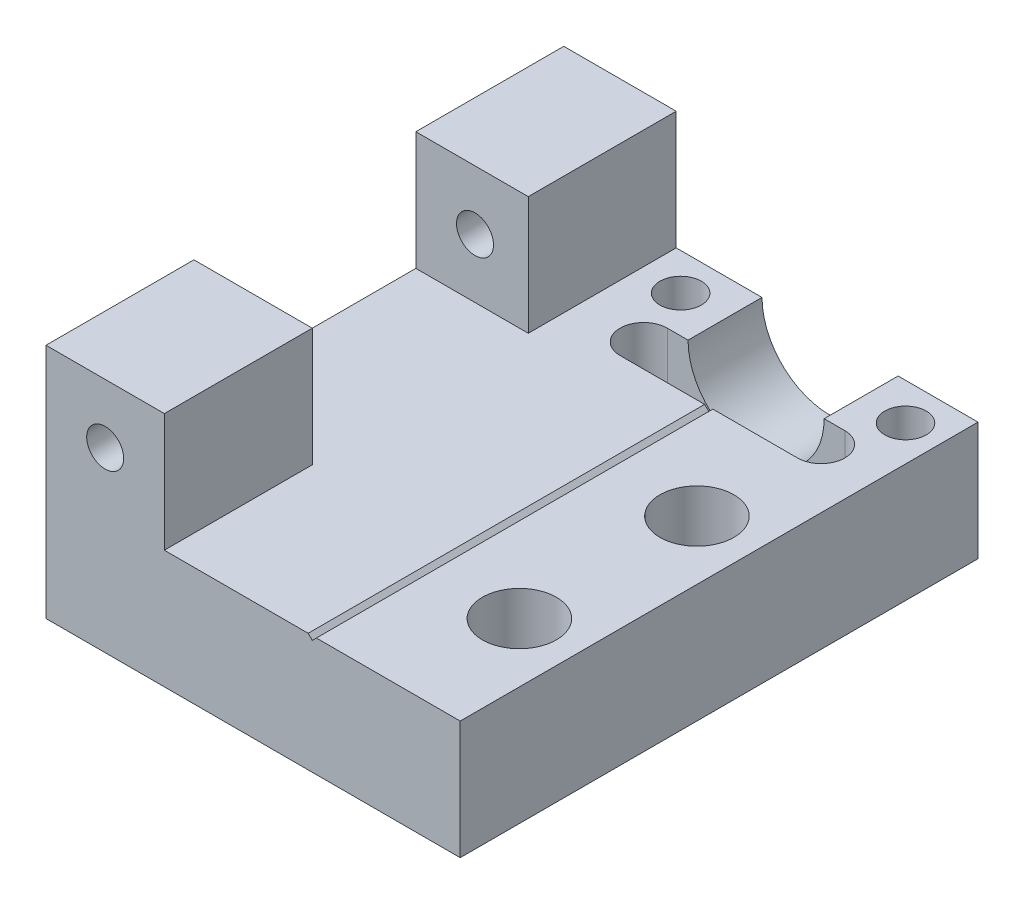
ISO-10303-21;
HEADER;
FILE_DESCRIPTION(('STEP AP214'),'2;1');
FILE_NAME('part.step','',(''),(''),'','','');
FILE_SCHEMA(('AUTOMOTIVE_DESIGN { 1 0 10303 214 1 1 1 1 }'));
ENDSEC;
DATA;
#1=APPLICATION_CONTEXT('core data for automotive mechanical design processes');
#2=APPLICATION_PROTOCOL_DEFINITION('international standard','automotive_design',2000,#1);
#3=PRODUCT_CONTEXT('',#1,'mechanical');
#4=PRODUCT('Part','Part','',(#3));
#5=PRODUCT_RELATED_PRODUCT_CATEGORY('part','',(#4));
#6=PRODUCT_DEFINITION_FORMATION('','',#4);
#7=PRODUCT_DEFINITION_CONTEXT('part definition',#1,'design');
#8=PRODUCT_DEFINITION('design','',#6,#7);
#9=PRODUCT_DEFINITION_SHAPE('','',#8);
#10=(LENGTH_UNIT() NAMED_UNIT(*) SI_UNIT(.MILLI.,.METRE.));
#11=(NAMED_UNIT(*) PLANE_ANGLE_UNIT() SI_UNIT($,.RADIAN.));
#12=(NAMED_UNIT(*) SI_UNIT($,.STERADIAN.) SOLID_ANGLE_UNIT());
#13=UNCERTAINTY_MEASURE_WITH_UNIT(LENGTH_MEASURE(1.E-05),#10,'distance_accuracy_value','');
#14=(GEOMETRIC_REPRESENTATION_CONTEXT(3) GLOBAL_UNCERTAINTY_ASSIGNED_CONTEXT((#13)) GLOBAL_UNIT_ASSIGNED_CONTEXT((#10,
#11,#12)) REPRESENTATION_CONTEXT('',''));
#15=CARTESIAN_POINT('',(0.,0.,0.));
#16=DIRECTION('',(0.,0.,1.));
#17=DIRECTION('',(1.,0.,0.));
#18=AXIS2_PLACEMENT_3D('',#15,#16,#17);
#19=CARTESIAN_POINT('',(0.,5.08,3.175));
#20=DIRECTION('',(0.,-1.,0.));
#21=DIRECTION('',(0.,0.,-1.));
#22=AXIS2_PLACEMENT_3D('',#19,#20,#21);
#23=PLANE('',#22);
#24=CARTESIAN_POINT('',(1.524,5.08,1.5875));
#25=DIRECTION('',(0.,1.,0.));
#26=DIRECTION('',(0.,0.,1.));
#27=AXIS2_PLACEMENT_3D('',#24,#25,#26);
#28=CIRCLE('',#27,0.888999999999998);
#29=CARTESIAN_POINT('',(1.524,5.08,2.4765));
#30=VERTEX_POINT('',#29);
#31=EDGE_CURVE('E288',#30,#30,#28,.T.);
#32=ORIENTED_EDGE('',*,*,#31,.F.);
#33=EDGE_LOOP('',(#32));
#34=FACE_BOUND('',#33,.T.);
#35=DIRECTION('',(0.,0.,-1.));
#36=VECTOR('',#35,1.);
#37=CARTESIAN_POINT('',(0.,5.08,22.225));
#38=LINE('',#37,#36);
#39=CARTESIAN_POINT('',(0.,5.08,22.225));
#40=VERTEX_POINT('',#39);
#41=CARTESIAN_POINT('',(0.,5.08,15.875));
#42=VERTEX_POINT('',#41);
#43=EDGE_CURVE('E205',#40,#42,#38,.T.);
#44=ORIENTED_EDGE('',*,*,#43,.F.);
#45=DIRECTION('',(-1.,0.,0.));
#46=VECTOR('',#45,1.);
#47=CARTESIAN_POINT('',(12.7,5.08,22.225));
#48=LINE('',#47,#46);
#49=CARTESIAN_POINT('',(6.17322330470336,5.08,22.225));
#50=VERTEX_POINT('',#49);
#51=EDGE_CURVE('E364',#50,#40,#48,.T.);
#52=ORIENTED_EDGE('',*,*,#51,.F.);
#53=DIRECTION('',(0.,0.,1.));
#54=VECTOR('',#53,1.);
#55=CARTESIAN_POINT('',(6.17322330470336,5.08,0.));
#56=LINE('',#55,#54);
#57=CARTESIAN_POINT('',(6.17322330470336,5.08,5.207));
#58=VERTEX_POINT('',#57);
#59=EDGE_CURVE('E304',#58,#50,#56,.T.);
#60=ORIENTED_EDGE('',*,*,#59,.F.);
#61=DIRECTION('',(1.,0.,0.));
#62=VECTOR('',#61,1.);
#63=CARTESIAN_POINT('',(2.54,5.08,5.207));
#64=LINE('',#63,#62);
#65=CARTESIAN_POINT('',(2.54,5.08,5.207));
#66=VERTEX_POINT('',#65);
#67=EDGE_CURVE('E338',#66,#58,#64,.T.);
#68=ORIENTED_EDGE('',*,*,#67,.F.);
#69=CARTESIAN_POINT('',(2.54,5.08,4.191));
#70=DIRECTION('',(0.,1.,0.));
#71=DIRECTION('',(0.,0.,1.));
#72=AXIS2_PLACEMENT_3D('',#69,#70,#71);
#73=CIRCLE('',#72,1.016);
#74=CARTESIAN_POINT('',(2.54,5.08,3.175));
#75=VERTEX_POINT('',#74);
#76=EDGE_CURVE('E316',#75,#66,#73,.T.);
#77=ORIENTED_EDGE('',*,*,#76,.F.);
#78=DIRECTION('',(1.,0.,0.));
#79=VECTOR('',#78,1.);
#80=CARTESIAN_POINT('',(2.54,5.08,3.175));
#81=LINE('',#80,#79);
#82=CARTESIAN_POINT('',(3.429,5.08,3.175));
#83=VERTEX_POINT('',#82);
#84=EDGE_CURVE('E329',#75,#83,#81,.T.);
#85=ORIENTED_EDGE('',*,*,#84,.T.);
#86=DIRECTION('',(0.,0.,-1.));
#87=VECTOR('',#86,1.);
#88=CARTESIAN_POINT('',(3.429,5.08,3.175));
#89=LINE('',#88,#87);
#90=CARTESIAN_POINT('',(3.429,5.08,0.));
#91=VERTEX_POINT('',#90);
#92=EDGE_CURVE('E374',#83,#91,#89,.T.);
#93=ORIENTED_EDGE('',*,*,#92,.T.);
#94=DIRECTION('',(-1.,0.,0.));
#95=VECTOR('',#94,1.);
#96=CARTESIAN_POINT('',(0.,5.08,0.));
#97=LINE('',#96,#95);
#98=CARTESIAN_POINT('',(-0.253999999999997,5.08,0.));
#99=VERTEX_POINT('',#98);
#100=EDGE_CURVE('E375',#91,#99,#97,.T.);
#101=ORIENTED_EDGE('',*,*,#100,.T.);
#102=DIRECTION('',(0.,0.,-1.));
#103=VECTOR('',#102,1.);
#104=CARTESIAN_POINT('',(-0.253999999999997,5.08,0.));
#105=LINE('',#104,#103);
#106=CARTESIAN_POINT('',(-0.253999999999996,5.08,6.35));
#107=VERTEX_POINT('',#106);
#108=EDGE_CURVE('E231',#107,#99,#105,.T.);
#109=ORIENTED_EDGE('',*,*,#108,.F.);
#110=DIRECTION('',(1.,0.,0.));
#111=VECTOR('',#110,1.);
#112=CARTESIAN_POINT('',(-5.08,5.08,6.35));
#113=LINE('',#112,#111);
#114=CARTESIAN_POINT('',(-5.08,5.08,6.35));
#115=VERTEX_POINT('',#114);
#116=EDGE_CURVE('E225',#115,#107,#113,.T.);
#117=ORIENTED_EDGE('',*,*,#116,.F.);
#118=DIRECTION('',(0.,0.,-1.));
#119=VECTOR('',#118,1.);
#120=CARTESIAN_POINT('',(-5.08,5.08,22.225));
#121=LINE('',#120,#119);
#122=CARTESIAN_POINT('',(-5.08,5.08,15.875));
#123=VERTEX_POINT('',#122);
#124=EDGE_CURVE('E262',#123,#115,#121,.T.);
#125=ORIENTED_EDGE('',*,*,#124,.F.);
#126=DIRECTION('',(-1.,0.,0.));
#127=VECTOR('',#126,1.);
#128=CARTESIAN_POINT('',(-5.08,5.08,15.875));
#129=LINE('',#128,#127);
#130=EDGE_CURVE('E202',#42,#123,#129,.T.);
#131=ORIENTED_EDGE('',*,*,#130,.F.);
#132=EDGE_LOOP('',(#44,#52,#60,#68,#77,#85,#93,#101,#109,#117,#125,#131));
#133=FACE_BOUND('',#132,.T.);
#134=ADVANCED_FACE('F41',(#34,#133),#23,.F.);
#135=CARTESIAN_POINT('',(10.16,5.08,17.145));
#136=DIRECTION('',(0.,1.,0.));
#137=DIRECTION('',(0.,0.,1.));
#138=AXIS2_PLACEMENT_3D('',#135,#136,#137);
#139=CIRCLE('',#138,1.5875);
#140=CARTESIAN_POINT('',(10.16,5.08,18.7325));
#141=VERTEX_POINT('',#140);
#142=EDGE_CURVE('E263',#141,#141,#139,.T.);
#143=ORIENTED_EDGE('',*,*,#142,.F.);
#144=EDGE_LOOP('',(#143));
#145=FACE_BOUND('',#144,.T.);
#146=CARTESIAN_POINT('',(10.16,5.08,9.525));
#147=DIRECTION('',(0.,1.,0.));
#148=DIRECTION('',(0.,0.,1.));
#149=AXIS2_PLACEMENT_3D('',#146,#147,#148);
#150=CIRCLE('',#149,1.5875);
#151=CARTESIAN_POINT('',(10.16,5.08,11.1125));
#152=VERTEX_POINT('',#151);
#153=EDGE_CURVE('E257',#152,#152,#150,.T.);
#154=ORIENTED_EDGE('',*,*,#153,.F.);
#155=EDGE_LOOP('',(#154));
#156=FACE_BOUND('',#155,.T.);
#157=CARTESIAN_POINT('',(6.52677669529664,5.08,5.207));
#158=VERTEX_POINT('',#157);
#159=CARTESIAN_POINT('',(10.16,5.08,5.207));
#160=VERTEX_POINT('',#159);
#161=EDGE_CURVE('E337',#158,#160,#64,.T.);
#162=ORIENTED_EDGE('',*,*,#161,.F.);
#163=DIRECTION('',(0.,0.,1.));
#164=VECTOR('',#163,1.);
#165=CARTESIAN_POINT('',(6.52677669529663,5.08,0.));
#166=LINE('',#165,#164);
#167=CARTESIAN_POINT('',(6.52677669529663,5.08,22.225));
#168=VERTEX_POINT('',#167);
#169=EDGE_CURVE('E66',#158,#168,#166,.T.);
#170=ORIENTED_EDGE('',*,*,#169,.T.);
#171=CARTESIAN_POINT('',(12.7,5.08,22.225));
#172=VERTEX_POINT('',#171);
#173=EDGE_CURVE('E359',#172,#168,#48,.T.);
#174=ORIENTED_EDGE('',*,*,#173,.F.);
#175=DIRECTION('',(0.,0.,-1.));
#176=VECTOR('',#175,1.);
#177=CARTESIAN_POINT('',(12.7,5.08,3.175));
#178=LINE('',#177,#176);
#179=CARTESIAN_POINT('',(12.7,5.08,0.));
#180=VERTEX_POINT('',#179);
#181=EDGE_CURVE('E397',#172,#180,#178,.T.);
#182=ORIENTED_EDGE('',*,*,#181,.T.);
#183=DIRECTION('',(-1.,0.,0.));
#184=VECTOR('',#183,1.);
#185=CARTESIAN_POINT('',(9.271,5.08,0.));
#186=LINE('',#185,#184);
#187=CARTESIAN_POINT('',(9.271,5.08,0.));
#188=VERTEX_POINT('',#187);
#189=EDGE_CURVE('E381',#180,#188,#186,.T.);
#190=ORIENTED_EDGE('',*,*,#189,.T.);
#191=DIRECTION('',(0.,0.,-1.));
#192=VECTOR('',#191,1.);
#193=CARTESIAN_POINT('',(9.271,5.08,3.175));
#194=LINE('',#193,#192);
#195=CARTESIAN_POINT('',(9.271,5.08,3.175));
#196=VERTEX_POINT('',#195);
#197=EDGE_CURVE('E393',#196,#188,#194,.T.);
#198=ORIENTED_EDGE('',*,*,#197,.F.);
#199=CARTESIAN_POINT('',(10.16,5.08,3.175));
#200=VERTEX_POINT('',#199);
#201=EDGE_CURVE('E307',#196,#200,#81,.T.);
#202=ORIENTED_EDGE('',*,*,#201,.T.);
#203=CARTESIAN_POINT('',(10.16,5.08,4.191));
#204=DIRECTION('',(0.,1.,0.));
#205=DIRECTION('',(0.,0.,1.));
#206=AXIS2_PLACEMENT_3D('',#203,#204,#205);
#207=CIRCLE('',#206,1.016);
#208=EDGE_CURVE('E333',#160,#200,#207,.T.);
#209=ORIENTED_EDGE('',*,*,#208,.F.);
#210=EDGE_LOOP('',(#162,#170,#174,#182,#190,#198,#202,#209));
#211=FACE_BOUND('',#210,.T.);
#212=CARTESIAN_POINT('',(11.176,5.08,1.5875));
#213=DIRECTION('',(0.,1.,0.));
#214=DIRECTION('',(0.,0.,1.));
#215=AXIS2_PLACEMENT_3D('',#212,#213,#214);
#216=CIRCLE('',#215,0.888999999999997);
#217=CARTESIAN_POINT('',(11.176,5.08,2.4765));
#218=VERTEX_POINT('',#217);
#219=EDGE_CURVE('E185',#218,#218,#216,.T.);
#220=ORIENTED_EDGE('',*,*,#219,.F.);
#221=EDGE_LOOP('',(#220));
#222=FACE_BOUND('',#221,.T.);
#223=ADVANCED_FACE('F412',(#145,#156,#211,#222),#23,.F.);
#224=CARTESIAN_POINT('',(0.,0.,3.175));
#225=DIRECTION('',(0.,1.,0.));
#226=DIRECTION('',(0.,0.,1.));
#227=AXIS2_PLACEMENT_3D('',#224,#225,#226);
#228=PLANE('',#227);
#229=CARTESIAN_POINT('',(10.16,0.,17.145));
#230=DIRECTION('',(0.,1.,0.));
#231=DIRECTION('',(0.,0.,1.));
#232=AXIS2_PLACEMENT_3D('',#229,#230,#231);
#233=CIRCLE('',#232,0.595376);
#234=CARTESIAN_POINT('',(10.16,0.,17.740376));
#235=VERTEX_POINT('',#234);
#236=EDGE_CURVE('E567',#235,#235,#233,.T.);
#237=ORIENTED_EDGE('',*,*,#236,.T.);
#238=EDGE_LOOP('',(#237));
#239=FACE_BOUND('',#238,.T.);
#240=CARTESIAN_POINT('',(10.16,0.,9.525));
#241=DIRECTION('',(0.,1.,0.));
#242=DIRECTION('',(0.,0.,1.));
#243=AXIS2_PLACEMENT_3D('',#240,#241,#242);
#244=CIRCLE('',#243,0.595376);
#245=CARTESIAN_POINT('',(10.16,0.,10.120376));
#246=VERTEX_POINT('',#245);
#247=EDGE_CURVE('E551',#246,#246,#244,.T.);
#248=ORIENTED_EDGE('',*,*,#247,.T.);
#249=EDGE_LOOP('',(#248));
#250=FACE_BOUND('',#249,.T.);
#251=CARTESIAN_POINT('',(11.176,0.,1.5875));
#252=DIRECTION('',(0.,1.,0.));
#253=DIRECTION('',(0.,0.,1.));
#254=AXIS2_PLACEMENT_3D('',#251,#252,#253);
#255=CIRCLE('',#254,0.888999999999998);
#256=CARTESIAN_POINT('',(11.176,0.,2.4765));
#257=VERTEX_POINT('',#256);
#258=EDGE_CURVE('E284',#257,#257,#255,.T.);
#259=ORIENTED_EDGE('',*,*,#258,.T.);
#260=EDGE_LOOP('',(#259));
#261=FACE_BOUND('',#260,.T.);
#262=CARTESIAN_POINT('',(1.524,0.,1.5875));
#263=DIRECTION('',(0.,1.,0.));
#264=DIRECTION('',(0.,0.,1.));
#265=AXIS2_PLACEMENT_3D('',#262,#263,#264);
#266=CIRCLE('',#265,0.888999999999998);
#267=CARTESIAN_POINT('',(1.524,0.,2.4765));
#268=VERTEX_POINT('',#267);
#269=EDGE_CURVE('E292',#268,#268,#266,.T.);
#270=ORIENTED_EDGE('',*,*,#269,.T.);
#271=EDGE_LOOP('',(#270));
#272=FACE_BOUND('',#271,.T.);
#273=DIRECTION('',(1.,0.,0.));
#274=VECTOR('',#273,1.);
#275=CARTESIAN_POINT('',(0.,0.,0.));
#276=LINE('',#275,#274);
#277=CARTESIAN_POINT('',(-5.08,0.,0.));
#278=VERTEX_POINT('',#277);
#279=CARTESIAN_POINT('',(12.7,0.,0.));
#280=VERTEX_POINT('',#279);
#281=EDGE_CURVE('E370',#278,#280,#276,.T.);
#282=ORIENTED_EDGE('',*,*,#281,.T.);
#283=DIRECTION('',(0.,0.,-1.));
#284=VECTOR('',#283,1.);
#285=CARTESIAN_POINT('',(12.7,0.,3.175));
#286=LINE('',#285,#284);
#287=CARTESIAN_POINT('',(12.7,0.,22.225));
#288=VERTEX_POINT('',#287);
#289=EDGE_CURVE('E401',#288,#280,#286,.T.);
#290=ORIENTED_EDGE('',*,*,#289,.F.);
#291=DIRECTION('',(-1.,0.,0.));
#292=VECTOR('',#291,1.);
#293=CARTESIAN_POINT('',(12.7,0.,22.225));
#294=LINE('',#293,#292);
#295=CARTESIAN_POINT('',(-5.08,0.,22.225));
#296=VERTEX_POINT('',#295);
#297=EDGE_CURVE('E358',#288,#296,#294,.T.);
#298=ORIENTED_EDGE('',*,*,#297,.T.);
#299=DIRECTION('',(0.,0.,1.));
#300=VECTOR('',#299,1.);
#301=CARTESIAN_POINT('',(-5.08,0.,22.225));
#302=LINE('',#301,#300);
#303=EDGE_CURVE('E181',#278,#296,#302,.T.);
#304=ORIENTED_EDGE('',*,*,#303,.F.);
#305=EDGE_LOOP('',(#282,#290,#298,#304));
#306=FACE_BOUND('',#305,.T.);
#307=DIRECTION('',(1.,0.,0.));
#308=VECTOR('',#307,1.);
#309=CARTESIAN_POINT('',(2.54,0.,3.175));
#310=LINE('',#309,#308);
#311=CARTESIAN_POINT('',(2.54,0.,3.175));
#312=VERTEX_POINT('',#311);
#313=CARTESIAN_POINT('',(10.16,0.,3.175));
#314=VERTEX_POINT('',#313);
#315=EDGE_CURVE('E312',#312,#314,#310,.T.);
#316=ORIENTED_EDGE('',*,*,#315,.F.);
#317=CARTESIAN_POINT('',(2.54,0.,4.191));
#318=DIRECTION('',(0.,1.,0.));
#319=DIRECTION('',(0.,0.,1.));
#320=AXIS2_PLACEMENT_3D('',#317,#318,#319);
#321=CIRCLE('',#320,1.016);
#322=CARTESIAN_POINT('',(2.54,0.,5.207));
#323=VERTEX_POINT('',#322);
#324=EDGE_CURVE('E324',#312,#323,#321,.T.);
#325=ORIENTED_EDGE('',*,*,#324,.T.);
#326=DIRECTION('',(1.,0.,0.));
#327=VECTOR('',#326,1.);
#328=CARTESIAN_POINT('',(2.54,0.,5.207));
#329=LINE('',#328,#327);
#330=CARTESIAN_POINT('',(10.16,0.,5.207));
#331=VERTEX_POINT('',#330);
#332=EDGE_CURVE('E320',#323,#331,#329,.T.);
#333=ORIENTED_EDGE('',*,*,#332,.T.);
#334=CARTESIAN_POINT('',(10.16,0.,4.191));
#335=DIRECTION('',(0.,1.,0.));
#336=DIRECTION('',(0.,0.,1.));
#337=AXIS2_PLACEMENT_3D('',#334,#335,#336);
#338=CIRCLE('',#337,1.016);
#339=EDGE_CURVE('E315',#331,#314,#338,.T.);
#340=ORIENTED_EDGE('',*,*,#339,.T.);
#341=EDGE_LOOP('',(#316,#325,#333,#340));
#342=FACE_BOUND('',#341,.T.);
#343=ADVANCED_FACE('F43',(#239,#250,#261,#272,#306,#342),#228,.F.);
#344=CARTESIAN_POINT('',(12.7,0.,3.175));
#345=DIRECTION('',(-1.,0.,0.));
#346=DIRECTION('',(0.,0.,1.));
#347=AXIS2_PLACEMENT_3D('',#344,#345,#346);
#348=PLANE('',#347);
#349=DIRECTION('',(0.,1.,0.));
#350=VECTOR('',#349,1.);
#351=CARTESIAN_POINT('',(12.7,0.,0.));
#352=LINE('',#351,#350);
#353=EDGE_CURVE('E378',#280,#180,#352,.T.);
#354=ORIENTED_EDGE('',*,*,#353,.T.);
#355=ORIENTED_EDGE('',*,*,#181,.F.);
#356=DIRECTION('',(0.,-1.,0.));
#357=VECTOR('',#356,1.);
#358=CARTESIAN_POINT('',(12.7,5.08,22.225));
#359=LINE('',#358,#357);
#360=EDGE_CURVE('E363',#172,#288,#359,.T.);
#361=ORIENTED_EDGE('',*,*,#360,.T.);
#362=ORIENTED_EDGE('',*,*,#289,.T.);
#363=EDGE_LOOP('',(#354,#355,#361,#362));
#364=FACE_BOUND('',#363,.T.);
#365=ADVANCED_FACE('F435',(#364),#348,.F.);
#366=CARTESIAN_POINT('',(6.35,5.08,3.175));
#367=DIRECTION('',(0.,0.,-1.));
#368=DIRECTION('',(-1.,0.,0.));
#369=AXIS2_PLACEMENT_3D('',#366,#367,#368);
#370=CYLINDRICAL_SURFACE('',#369,2.921);
#371=CARTESIAN_POINT('',(6.35,5.08,0.));
#372=DIRECTION('',(0.,0.,-1.));
#373=DIRECTION('',(1.,0.,0.));
#374=AXIS2_PLACEMENT_3D('',#371,#372,#373);
#375=CIRCLE('',#374,2.921);
#376=EDGE_CURVE('E384',#188,#91,#375,.T.);
#377=ORIENTED_EDGE('',*,*,#376,.T.);
#378=ORIENTED_EDGE('',*,*,#92,.F.);
#379=CARTESIAN_POINT('',(6.35,5.08,3.175));
#380=DIRECTION('',(0.,0.,-1.));
#381=DIRECTION('',(1.,0.,0.));
#382=AXIS2_PLACEMENT_3D('',#379,#380,#381);
#383=CIRCLE('',#382,2.921);
#384=EDGE_CURVE('E371',#196,#83,#383,.T.);
#385=ORIENTED_EDGE('',*,*,#384,.F.);
#386=ORIENTED_EDGE('',*,*,#197,.T.);
#387=EDGE_LOOP('',(#377,#378,#385,#386));
#388=FACE_BOUND('',#387,.T.);
#389=ADVANCED_FACE('F441',(#388),#370,.F.);
#390=CARTESIAN_POINT('',(6.35,5.08,0.));
#391=DIRECTION('',(0.,0.,1.));
#392=DIRECTION('',(1.,0.,0.));
#393=AXIS2_PLACEMENT_3D('',#390,#391,#392);
#394=PLANE('',#393);
#395=CARTESIAN_POINT('',(-2.54,7.62,0.));
#396=DIRECTION('',(0.,0.,1.));
#397=DIRECTION('',(1.,0.,0.));
#398=AXIS2_PLACEMENT_3D('',#395,#396,#397);
#399=CIRCLE('',#398,0.793749999999995);
#400=CARTESIAN_POINT('',(-1.74625000000001,7.62,0.));
#401=VERTEX_POINT('',#400);
#402=EDGE_CURVE('E550',#401,#401,#399,.T.);
#403=ORIENTED_EDGE('',*,*,#402,.T.);
#404=EDGE_LOOP('',(#403));
#405=FACE_BOUND('',#404,.T.);
#406=ORIENTED_EDGE('',*,*,#281,.F.);
#407=DIRECTION('',(0.,-1.,0.));
#408=VECTOR('',#407,1.);
#409=CARTESIAN_POINT('',(-5.08,5.08,0.));
#410=LINE('',#409,#408);
#411=CARTESIAN_POINT('',(-5.08,10.16,0.));
#412=VERTEX_POINT('',#411);
#413=EDGE_CURVE('E276',#412,#278,#410,.T.);
#414=ORIENTED_EDGE('',*,*,#413,.F.);
#415=DIRECTION('',(-1.,0.,0.));
#416=VECTOR('',#415,1.);
#417=CARTESIAN_POINT('',(-5.08,10.16,0.));
#418=LINE('',#417,#416);
#419=CARTESIAN_POINT('',(-0.253999999999997,10.16,0.));
#420=VERTEX_POINT('',#419);
#421=EDGE_CURVE('E237',#420,#412,#418,.T.);
#422=ORIENTED_EDGE('',*,*,#421,.F.);
#423=DIRECTION('',(0.,-1.,0.));
#424=VECTOR('',#423,1.);
#425=CARTESIAN_POINT('',(-0.253999999999997,10.16,0.));
#426=LINE('',#425,#424);
#427=EDGE_CURVE('E241',#420,#99,#426,.T.);
#428=ORIENTED_EDGE('',*,*,#427,.T.);
#429=ORIENTED_EDGE('',*,*,#100,.F.);
#430=ORIENTED_EDGE('',*,*,#376,.F.);
#431=ORIENTED_EDGE('',*,*,#189,.F.);
#432=ORIENTED_EDGE('',*,*,#353,.F.);
#433=EDGE_LOOP('',(#406,#414,#422,#428,#429,#430,#431,#432));
#434=FACE_BOUND('',#433,.T.);
#435=ADVANCED_FACE('F455',(#405,#434),#394,.F.);
#436=CARTESIAN_POINT('',(12.7,5.08,22.225));
#437=DIRECTION('',(0.,0.,1.));
#438=DIRECTION('',(1.,0.,0.));
#439=AXIS2_PLACEMENT_3D('',#436,#437,#438);
#440=PLANE('',#439);
#441=CARTESIAN_POINT('',(-2.54,7.62,22.225));
#442=DIRECTION('',(0.,0.,1.));
#443=DIRECTION('',(1.,0.,0.));
#444=AXIS2_PLACEMENT_3D('',#441,#442,#443);
#445=CIRCLE('',#444,0.793749999999997);
#446=CARTESIAN_POINT('',(-1.74625,7.62,22.225));
#447=VERTEX_POINT('',#446);
#448=EDGE_CURVE('E547',#447,#447,#445,.T.);
#449=ORIENTED_EDGE('',*,*,#448,.F.);
#450=EDGE_LOOP('',(#449));
#451=FACE_BOUND('',#450,.T.);
#452=DIRECTION('',(0.707106781186556,-0.707106781186539,0.));
#453=VECTOR('',#452,1.);
#454=CARTESIAN_POINT('',(6.17322330470336,5.08,22.225));
#455=LINE('',#454,#453);
#456=CARTESIAN_POINT('',(6.35,4.90322330470336,22.225));
#457=VERTEX_POINT('',#456);
#458=EDGE_CURVE('E296',#50,#457,#455,.T.);
#459=ORIENTED_EDGE('',*,*,#458,.F.);
#460=ORIENTED_EDGE('',*,*,#51,.T.);
#461=DIRECTION('',(0.,-1.,0.));
#462=VECTOR('',#461,1.);
#463=CARTESIAN_POINT('',(0.,10.16,22.225));
#464=LINE('',#463,#462);
#465=CARTESIAN_POINT('',(0.,10.16,22.225));
#466=VERTEX_POINT('',#465);
#467=EDGE_CURVE('E192',#466,#40,#464,.T.);
#468=ORIENTED_EDGE('',*,*,#467,.F.);
#469=DIRECTION('',(1.,0.,0.));
#470=VECTOR('',#469,1.);
#471=CARTESIAN_POINT('',(-5.08,10.16,22.225));
#472=LINE('',#471,#470);
#473=CARTESIAN_POINT('',(-5.08,10.16,22.225));
#474=VERTEX_POINT('',#473);
#475=EDGE_CURVE('E188',#474,#466,#472,.T.);
#476=ORIENTED_EDGE('',*,*,#475,.F.);
#477=DIRECTION('',(0.,1.,0.));
#478=VECTOR('',#477,1.);
#479=CARTESIAN_POINT('',(-5.08,5.08,22.225));
#480=LINE('',#479,#478);
#481=EDGE_CURVE('E174',#296,#474,#480,.T.);
#482=ORIENTED_EDGE('',*,*,#481,.F.);
#483=ORIENTED_EDGE('',*,*,#297,.F.);
#484=ORIENTED_EDGE('',*,*,#360,.F.);
#485=ORIENTED_EDGE('',*,*,#173,.T.);
#486=DIRECTION('',(0.707106781186539,0.707106781186556,0.));
#487=VECTOR('',#486,1.);
#488=CARTESIAN_POINT('',(6.35,4.90322330470336,22.225));
#489=LINE('',#488,#487);
#490=EDGE_CURVE('E300',#457,#168,#489,.T.);
#491=ORIENTED_EDGE('',*,*,#490,.F.);
#492=EDGE_LOOP('',(#459,#460,#468,#476,#482,#483,#484,#485,#491));
#493=FACE_BOUND('',#492,.T.);
#494=ADVANCED_FACE('F190',(#451,#493),#440,.T.);
#495=CARTESIAN_POINT('',(2.54,0.,3.175));
#496=DIRECTION('',(0.,0.,1.));
#497=DIRECTION('',(1.,0.,0.));
#498=AXIS2_PLACEMENT_3D('',#495,#496,#497);
#499=PLANE('',#498);
#500=ORIENTED_EDGE('',*,*,#384,.T.);
#501=ORIENTED_EDGE('',*,*,#84,.F.);
#502=DIRECTION('',(0.,1.,0.));
#503=VECTOR('',#502,1.);
#504=CARTESIAN_POINT('',(2.54,0.,3.175));
#505=LINE('',#504,#503);
#506=EDGE_CURVE('E328',#312,#75,#505,.T.);
#507=ORIENTED_EDGE('',*,*,#506,.F.);
#508=ORIENTED_EDGE('',*,*,#315,.T.);
#509=DIRECTION('',(0.,1.,0.));
#510=VECTOR('',#509,1.);
#511=CARTESIAN_POINT('',(10.16,0.,3.175));
#512=LINE('',#511,#510);
#513=EDGE_CURVE('E355',#314,#200,#512,.T.);
#514=ORIENTED_EDGE('',*,*,#513,.T.);
#515=ORIENTED_EDGE('',*,*,#201,.F.);
#516=EDGE_LOOP('',(#500,#501,#507,#508,#514,#515));
#517=FACE_BOUND('',#516,.T.);
#518=ADVANCED_FACE('F421',(#517),#499,.T.);
#519=CARTESIAN_POINT('',(10.16,0.,4.191));
#520=DIRECTION('',(0.,1.,0.));
#521=DIRECTION('',(0.,0.,1.));
#522=AXIS2_PLACEMENT_3D('',#519,#520,#521);
#523=CYLINDRICAL_SURFACE('',#522,1.016);
#524=ORIENTED_EDGE('',*,*,#208,.T.);
#525=ORIENTED_EDGE('',*,*,#513,.F.);
#526=ORIENTED_EDGE('',*,*,#339,.F.);
#527=DIRECTION('',(0.,1.,0.));
#528=VECTOR('',#527,1.);
#529=CARTESIAN_POINT('',(10.16,0.,5.207));
#530=LINE('',#529,#528);
#531=EDGE_CURVE('E351',#331,#160,#530,.T.);
#532=ORIENTED_EDGE('',*,*,#531,.T.);
#533=EDGE_LOOP('',(#524,#525,#526,#532));
#534=FACE_BOUND('',#533,.T.);
#535=ADVANCED_FACE('F426',(#534),#523,.F.);
#536=CARTESIAN_POINT('',(2.54,0.,5.207));
#537=DIRECTION('',(0.,0.,1.));
#538=DIRECTION('',(1.,0.,0.));
#539=AXIS2_PLACEMENT_3D('',#536,#537,#538);
#540=PLANE('',#539);
#541=ORIENTED_EDGE('',*,*,#67,.T.);
#542=DIRECTION('',(0.707106781186556,-0.707106781186539,0.));
#543=VECTOR('',#542,1.);
#544=CARTESIAN_POINT('',(6.89661165235163,4.35661165235174,5.207));
#545=LINE('',#544,#543);
#546=CARTESIAN_POINT('',(6.35,4.90322330470336,5.207));
#547=VERTEX_POINT('',#546);
#548=EDGE_CURVE('E11',#58,#547,#545,.T.);
#549=ORIENTED_EDGE('',*,*,#548,.T.);
#550=DIRECTION('',(0.707106781186539,0.707106781186556,0.));
#551=VECTOR('',#550,1.);
#552=CARTESIAN_POINT('',(1.99338834764837,0.546611652351621,5.207));
#553=LINE('',#552,#551);
#554=EDGE_CURVE('E51',#547,#158,#553,.T.);
#555=ORIENTED_EDGE('',*,*,#554,.T.);
#556=ORIENTED_EDGE('',*,*,#161,.T.);
#557=ORIENTED_EDGE('',*,*,#531,.F.);
#558=ORIENTED_EDGE('',*,*,#332,.F.);
#559=DIRECTION('',(0.,1.,0.));
#560=VECTOR('',#559,1.);
#561=CARTESIAN_POINT('',(2.54,0.,5.207));
#562=LINE('',#561,#560);
#563=EDGE_CURVE('E348',#323,#66,#562,.T.);
#564=ORIENTED_EDGE('',*,*,#563,.T.);
#565=EDGE_LOOP('',(#541,#549,#555,#556,#557,#558,#564));
#566=FACE_BOUND('',#565,.T.);
#567=ADVANCED_FACE('F408',(#566),#540,.F.);
#568=CARTESIAN_POINT('',(2.54,0.,4.191));
#569=DIRECTION('',(0.,1.,0.));
#570=DIRECTION('',(0.,0.,1.));
#571=AXIS2_PLACEMENT_3D('',#568,#569,#570);
#572=CYLINDRICAL_SURFACE('',#571,1.016);
#573=ORIENTED_EDGE('',*,*,#76,.T.);
#574=ORIENTED_EDGE('',*,*,#563,.F.);
#575=ORIENTED_EDGE('',*,*,#324,.F.);
#576=ORIENTED_EDGE('',*,*,#506,.T.);
#577=EDGE_LOOP('',(#573,#574,#575,#576));
#578=FACE_BOUND('',#577,.T.);
#579=ADVANCED_FACE('F431',(#578),#572,.F.);
#580=CARTESIAN_POINT('',(6.17322330470336,5.08,0.));
#581=DIRECTION('',(-0.707106781186539,-0.707106781186556,0.));
#582=DIRECTION('',(0.707106781186556,-0.707106781186539,0.));
#583=AXIS2_PLACEMENT_3D('',#580,#581,#582);
#584=PLANE('',#583);
#585=ORIENTED_EDGE('',*,*,#59,.T.);
#586=ORIENTED_EDGE('',*,*,#458,.T.);
#587=DIRECTION('',(0.,0.,1.));
#588=VECTOR('',#587,1.);
#589=CARTESIAN_POINT('',(6.35,4.90322330470336,0.));
#590=LINE('',#589,#588);
#591=EDGE_CURVE('E303',#547,#457,#590,.T.);
#592=ORIENTED_EDGE('',*,*,#591,.F.);
#593=ORIENTED_EDGE('',*,*,#548,.F.);
#594=EDGE_LOOP('',(#585,#586,#592,#593));
#595=FACE_BOUND('',#594,.T.);
#596=ADVANCED_FACE('F530',(#595),#584,.F.);
#597=CARTESIAN_POINT('',(6.35,4.90322330470336,0.));
#598=DIRECTION('',(0.707106781186556,-0.707106781186539,0.));
#599=DIRECTION('',(0.707106781186539,0.707106781186556,0.));
#600=AXIS2_PLACEMENT_3D('',#597,#598,#599);
#601=PLANE('',#600);
#602=ORIENTED_EDGE('',*,*,#591,.T.);
#603=ORIENTED_EDGE('',*,*,#490,.T.);
#604=ORIENTED_EDGE('',*,*,#169,.F.);
#605=ORIENTED_EDGE('',*,*,#554,.F.);
#606=EDGE_LOOP('',(#602,#603,#604,#605));
#607=FACE_BOUND('',#606,.T.);
#608=ADVANCED_FACE('F526',(#607),#601,.F.);
#609=CARTESIAN_POINT('',(1.524,5.08,1.5875));
#610=DIRECTION('',(0.,1.,0.));
#611=DIRECTION('',(0.,0.,1.));
#612=AXIS2_PLACEMENT_3D('',#609,#610,#611);
#613=CYLINDRICAL_SURFACE('',#612,0.888999999999998);
#614=ORIENTED_EDGE('',*,*,#269,.F.);
#615=EDGE_LOOP('',(#614));
#616=FACE_BOUND('',#615,.T.);
#617=ORIENTED_EDGE('',*,*,#31,.T.);
#618=EDGE_LOOP('',(#617));
#619=FACE_BOUND('',#618,.T.);
#620=ADVANCED_FACE('F522',(#616,#619),#613,.F.);
#621=CARTESIAN_POINT('',(11.176,5.08,1.5875));
#622=DIRECTION('',(0.,1.,0.));
#623=DIRECTION('',(0.,0.,1.));
#624=AXIS2_PLACEMENT_3D('',#621,#622,#623);
#625=CYLINDRICAL_SURFACE('',#624,0.888999999999998);
#626=ORIENTED_EDGE('',*,*,#258,.F.);
#627=EDGE_LOOP('',(#626));
#628=FACE_BOUND('',#627,.T.);
#629=ORIENTED_EDGE('',*,*,#219,.T.);
#630=EDGE_LOOP('',(#629));
#631=FACE_BOUND('',#630,.T.);
#632=ADVANCED_FACE('F519',(#628,#631),#625,.F.);
#633=CARTESIAN_POINT('',(-5.08,0.,0.));
#634=DIRECTION('',(-1.,0.,0.));
#635=DIRECTION('',(0.,0.,1.));
#636=AXIS2_PLACEMENT_3D('',#633,#634,#635);
#637=PLANE('',#636);
#638=ORIENTED_EDGE('',*,*,#481,.T.);
#639=DIRECTION('',(0.,0.,1.));
#640=VECTOR('',#639,1.);
#641=CARTESIAN_POINT('',(-5.08,10.16,22.225));
#642=LINE('',#641,#640);
#643=CARTESIAN_POINT('',(-5.08,10.16,15.875));
#644=VERTEX_POINT('',#643);
#645=EDGE_CURVE('E178',#644,#474,#642,.T.);
#646=ORIENTED_EDGE('',*,*,#645,.F.);
#647=DIRECTION('',(0.,-1.,0.));
#648=VECTOR('',#647,1.);
#649=CARTESIAN_POINT('',(-5.08,10.16,15.875));
#650=LINE('',#649,#648);
#651=EDGE_CURVE('E58',#644,#123,#650,.T.);
#652=ORIENTED_EDGE('',*,*,#651,.T.);
#653=ORIENTED_EDGE('',*,*,#124,.T.);
#654=DIRECTION('',(0.,-1.,0.));
#655=VECTOR('',#654,1.);
#656=CARTESIAN_POINT('',(-5.08,10.16,6.35));
#657=LINE('',#656,#655);
#658=CARTESIAN_POINT('',(-5.08,10.16,6.35));
#659=VERTEX_POINT('',#658);
#660=EDGE_CURVE('E253',#659,#115,#657,.T.);
#661=ORIENTED_EDGE('',*,*,#660,.F.);
#662=DIRECTION('',(0.,0.,1.));
#663=VECTOR('',#662,1.);
#664=CARTESIAN_POINT('',(-5.08,10.16,0.));
#665=LINE('',#664,#663);
#666=EDGE_CURVE('E226',#412,#659,#665,.T.);
#667=ORIENTED_EDGE('',*,*,#666,.F.);
#668=ORIENTED_EDGE('',*,*,#413,.T.);
#669=ORIENTED_EDGE('',*,*,#303,.T.);
#670=EDGE_LOOP('',(#638,#646,#652,#653,#661,#667,#668,#669));
#671=FACE_BOUND('',#670,.T.);
#672=ADVANCED_FACE('F176',(#671),#637,.T.);
#673=CARTESIAN_POINT('',(10.16,1.778,9.525));
#674=DIRECTION('',(0.,1.,0.));
#675=DIRECTION('',(0.,0.,1.));
#676=AXIS2_PLACEMENT_3D('',#673,#674,#675);
#677=CYLINDRICAL_SURFACE('',#676,1.5875);
#678=CARTESIAN_POINT('',(10.16,1.778,9.525));
#679=DIRECTION('',(0.,1.,0.));
#680=DIRECTION('',(0.,0.,1.));
#681=AXIS2_PLACEMENT_3D('',#678,#679,#680);
#682=CIRCLE('',#681,1.5875);
#683=CARTESIAN_POINT('',(10.16,1.778,11.1125));
#684=VERTEX_POINT('',#683);
#685=EDGE_CURVE('E267',#684,#684,#682,.T.);
#686=CARTESIAN_POINT('',(10.16,1.778,11.1125));
#687=CARTESIAN_POINT('',(10.16,1.81239583333333,11.1125));
#688=CARTESIAN_POINT('',(10.16,1.84679166666667,11.1125));
#689=CARTESIAN_POINT('',(10.16,1.91558333333333,11.1125));
#690=CARTESIAN_POINT('',(10.16,1.94997916666667,11.1125));
#691=CARTESIAN_POINT('',(10.16,2.01877083333333,11.1125));
#692=CARTESIAN_POINT('',(10.16,2.05316666666667,11.1125));
#693=CARTESIAN_POINT('',(10.16,2.12195833333333,11.1125));
#694=CARTESIAN_POINT('',(10.16,2.15635416666667,11.1125));
#695=CARTESIAN_POINT('',(10.16,2.22514583333333,11.1125));
#696=CARTESIAN_POINT('',(10.16,2.25954166666667,11.1125));
#697=CARTESIAN_POINT('',(10.16,2.32833333333333,11.1125));
#698=CARTESIAN_POINT('',(10.16,2.36272916666667,11.1125));
#699=CARTESIAN_POINT('',(10.16,2.43152083333333,11.1125));
#700=CARTESIAN_POINT('',(10.16,2.46591666666667,11.1125));
#701=CARTESIAN_POINT('',(10.16,2.53470833333333,11.1125));
#702=CARTESIAN_POINT('',(10.16,2.56910416666667,11.1125));
#703=CARTESIAN_POINT('',(10.16,2.63789583333333,11.1125));
#704=CARTESIAN_POINT('',(10.16,2.67229166666667,11.1125));
#705=CARTESIAN_POINT('',(10.16,2.74108333333333,11.1125));
#706=CARTESIAN_POINT('',(10.16,2.77547916666667,11.1125));
#707=CARTESIAN_POINT('',(10.16,2.84427083333333,11.1125));
#708=CARTESIAN_POINT('',(10.16,2.87866666666667,11.1125));
#709=CARTESIAN_POINT('',(10.16,2.94745833333333,11.1125));
#710=CARTESIAN_POINT('',(10.16,2.98185416666667,11.1125));
#711=CARTESIAN_POINT('',(10.16,3.05064583333333,11.1125));
#712=CARTESIAN_POINT('',(10.16,3.08504166666667,11.1125));
#713=CARTESIAN_POINT('',(10.16,3.15383333333333,11.1125));
#714=CARTESIAN_POINT('',(10.16,3.18822916666667,11.1125));
#715=CARTESIAN_POINT('',(10.16,3.25702083333333,11.1125));
#716=CARTESIAN_POINT('',(10.16,3.29141666666667,11.1125));
#717=CARTESIAN_POINT('',(10.16,3.36020833333333,11.1125));
#718=CARTESIAN_POINT('',(10.16,3.39460416666667,11.1125));
#719=CARTESIAN_POINT('',(10.16,3.46339583333333,11.1125));
#720=CARTESIAN_POINT('',(10.16,3.49779166666667,11.1125));
#721=CARTESIAN_POINT('',(10.16,3.56658333333333,11.1125));
#722=CARTESIAN_POINT('',(10.16,3.60097916666667,11.1125));
#723=CARTESIAN_POINT('',(10.16,3.66977083333333,11.1125));
#724=CARTESIAN_POINT('',(10.16,3.70416666666667,11.1125));
#725=CARTESIAN_POINT('',(10.16,3.77295833333333,11.1125));
#726=CARTESIAN_POINT('',(10.16,3.80735416666667,11.1125));
#727=CARTESIAN_POINT('',(10.16,3.87614583333333,11.1125));
#728=CARTESIAN_POINT('',(10.16,3.91054166666667,11.1125));
#729=CARTESIAN_POINT('',(10.16,3.97933333333333,11.1125));
#730=CARTESIAN_POINT('',(10.16,4.01372916666667,11.1125));
#731=CARTESIAN_POINT('',(10.16,4.08252083333333,11.1125));
#732=CARTESIAN_POINT('',(10.16,4.11691666666667,11.1125));
#733=CARTESIAN_POINT('',(10.16,4.18570833333333,11.1125));
#734=CARTESIAN_POINT('',(10.16,4.22010416666667,11.1125));
#735=CARTESIAN_POINT('',(10.16,4.28889583333333,11.1125));
#736=CARTESIAN_POINT('',(10.16,4.32329166666667,11.1125));
#737=CARTESIAN_POINT('',(10.16,4.39208333333333,11.1125));
#738=CARTESIAN_POINT('',(10.16,4.42647916666667,11.1125));
#739=CARTESIAN_POINT('',(10.16,4.49527083333333,11.1125));
#740=CARTESIAN_POINT('',(10.16,4.52966666666667,11.1125));
#741=CARTESIAN_POINT('',(10.16,4.59845833333333,11.1125));
#742=CARTESIAN_POINT('',(10.16,4.63285416666667,11.1125));
#743=CARTESIAN_POINT('',(10.16,4.70164583333333,11.1125));
#744=CARTESIAN_POINT('',(10.16,4.73604166666667,11.1125));
#745=CARTESIAN_POINT('',(10.16,4.80483333333333,11.1125));
#746=CARTESIAN_POINT('',(10.16,4.83922916666667,11.1125));
#747=CARTESIAN_POINT('',(10.16,4.90802083333333,11.1125));
#748=CARTESIAN_POINT('',(10.16,4.94241666666667,11.1125));
#749=CARTESIAN_POINT('',(10.16,5.01120833333333,11.1125));
#750=CARTESIAN_POINT('',(10.16,5.04560416666667,11.1125));
#751=CARTESIAN_POINT('',(10.16,5.08,11.1125));
#752=B_SPLINE_CURVE_WITH_KNOTS('',3,(#686,#687,#688,#689,#690,#691,#692,#693,#694,#695,#696,
#697,#698,#699,#700,#701,#702,#703,#704,#705,#706,#707,#708,#709,#710,#711,#712,#713,#714,#715,
#716,#717,#718,#719,#720,#721,#722,#723,#724,#725,#726,#727,#728,#729,#730,#731,#732,#733,#734,
#735,#736,#737,#738,#739,#740,#741,#742,#743,#744,#745,#746,#747,#748,#749,#750,#751),
.UNSPECIFIED.,.F.,.F.,(4,2,2,2,2,2,2,2,2,2,2,2,2,2,2,2,2,2,2,2,2,2,2,2,2,2,2,2,2,2,2,2,4),(0.,
0.1031875,0.206375,0.3095625,0.41275,0.5159375,0.619125,0.7223125,0.8255,0.9286875,1.031875,
1.1350625,1.23825,1.3414375,1.444625,1.5478125,1.651,1.7541875,1.857375,1.9605625,2.06375,
2.1669375,2.270125,2.3733125,2.4765,2.5796875,2.682875,2.7860625,2.88925,2.9924375,3.095625,
3.1988125,3.302),.UNSPECIFIED.);
#753=EDGE_CURVE('BSEAM512',#684,#152,#752,.T.);
#754=ORIENTED_EDGE('',*,*,#685,.F.);
#755=ORIENTED_EDGE('',*,*,#153,.T.);
#756=ORIENTED_EDGE('',*,*,#753,.T.);
#757=ORIENTED_EDGE('',*,*,#753,.F.);
#758=EDGE_LOOP('',(#754,#756,#755,#757));
#759=FACE_BOUND('',#758,.T.);
#760=ADVANCED_FACE('F512',(#759),#677,.F.);
#761=CARTESIAN_POINT('',(10.16,1.778,9.525));
#762=DIRECTION('',(0.,1.,0.));
#763=DIRECTION('',(0.,0.,1.));
#764=AXIS2_PLACEMENT_3D('',#761,#762,#763);
#765=PLANE('',#764);
#766=CARTESIAN_POINT('',(10.16,1.778,9.525));
#767=DIRECTION('',(0.,1.,0.));
#768=DIRECTION('',(0.,0.,1.));
#769=AXIS2_PLACEMENT_3D('',#766,#767,#768);
#770=CIRCLE('',#769,0.595376);
#771=CARTESIAN_POINT('',(10.16,1.778,10.120376));
#772=VERTEX_POINT('',#771);
#773=EDGE_CURVE('E557',#772,#772,#770,.T.);
#774=ORIENTED_EDGE('',*,*,#773,.F.);
#775=EDGE_LOOP('',(#774));
#776=FACE_BOUND('',#775,.T.);
#777=ORIENTED_EDGE('',*,*,#685,.T.);
#778=EDGE_LOOP('',(#777));
#779=FACE_BOUND('',#778,.T.);
#780=ADVANCED_FACE('F508',(#776,#779),#765,.T.);
#781=CARTESIAN_POINT('',(10.16,1.778,17.145));
#782=DIRECTION('',(0.,1.,0.));
#783=DIRECTION('',(0.,0.,1.));
#784=AXIS2_PLACEMENT_3D('',#781,#782,#783);
#785=CYLINDRICAL_SURFACE('',#784,1.5875);
#786=CARTESIAN_POINT('',(10.16,1.778,17.145));
#787=DIRECTION('',(0.,1.,0.));
#788=DIRECTION('',(0.,0.,1.));
#789=AXIS2_PLACEMENT_3D('',#786,#787,#788);
#790=CIRCLE('',#789,1.5875);
#791=CARTESIAN_POINT('',(10.16,1.778,18.7325));
#792=VERTEX_POINT('',#791);
#793=EDGE_CURVE('E258',#792,#792,#790,.T.);
#794=CARTESIAN_POINT('',(10.16,1.778,18.7325));
#795=CARTESIAN_POINT('',(10.16,1.81239583333333,18.7325));
#796=CARTESIAN_POINT('',(10.16,1.84679166666667,18.7325));
#797=CARTESIAN_POINT('',(10.16,1.91558333333333,18.7325));
#798=CARTESIAN_POINT('',(10.16,1.94997916666667,18.7325));
#799=CARTESIAN_POINT('',(10.16,2.01877083333333,18.7325));
#800=CARTESIAN_POINT('',(10.16,2.05316666666667,18.7325));
#801=CARTESIAN_POINT('',(10.16,2.12195833333333,18.7325));
#802=CARTESIAN_POINT('',(10.16,2.15635416666667,18.7325));
#803=CARTESIAN_POINT('',(10.16,2.22514583333333,18.7325));
#804=CARTESIAN_POINT('',(10.16,2.25954166666667,18.7325));
#805=CARTESIAN_POINT('',(10.16,2.32833333333333,18.7325));
#806=CARTESIAN_POINT('',(10.16,2.36272916666667,18.7325));
#807=CARTESIAN_POINT('',(10.16,2.43152083333333,18.7325));
#808=CARTESIAN_POINT('',(10.16,2.46591666666667,18.7325));
#809=CARTESIAN_POINT('',(10.16,2.53470833333333,18.7325));
#810=CARTESIAN_POINT('',(10.16,2.56910416666667,18.7325));
#811=CARTESIAN_POINT('',(10.16,2.63789583333333,18.7325));
#812=CARTESIAN_POINT('',(10.16,2.67229166666667,18.7325));
#813=CARTESIAN_POINT('',(10.16,2.74108333333333,18.7325));
#814=CARTESIAN_POINT('',(10.16,2.77547916666667,18.7325));
#815=CARTESIAN_POINT('',(10.16,2.84427083333333,18.7325));
#816=CARTESIAN_POINT('',(10.16,2.87866666666667,18.7325));
#817=CARTESIAN_POINT('',(10.16,2.94745833333333,18.7325));
#818=CARTESIAN_POINT('',(10.16,2.98185416666667,18.7325));
#819=CARTESIAN_POINT('',(10.16,3.05064583333333,18.7325));
#820=CARTESIAN_POINT('',(10.16,3.08504166666667,18.7325));
#821=CARTESIAN_POINT('',(10.16,3.15383333333333,18.7325));
#822=CARTESIAN_POINT('',(10.16,3.18822916666667,18.7325));
#823=CARTESIAN_POINT('',(10.16,3.25702083333333,18.7325));
#824=CARTESIAN_POINT('',(10.16,3.29141666666667,18.7325));
#825=CARTESIAN_POINT('',(10.16,3.36020833333333,18.7325));
#826=CARTESIAN_POINT('',(10.16,3.39460416666667,18.7325));
#827=CARTESIAN_POINT('',(10.16,3.46339583333333,18.7325));
#828=CARTESIAN_POINT('',(10.16,3.49779166666667,18.7325));
#829=CARTESIAN_POINT('',(10.16,3.56658333333333,18.7325));
#830=CARTESIAN_POINT('',(10.16,3.60097916666667,18.7325));
#831=CARTESIAN_POINT('',(10.16,3.66977083333333,18.7325));
#832=CARTESIAN_POINT('',(10.16,3.70416666666667,18.7325));
#833=CARTESIAN_POINT('',(10.16,3.77295833333333,18.7325));
#834=CARTESIAN_POINT('',(10.16,3.80735416666667,18.7325));
#835=CARTESIAN_POINT('',(10.16,3.87614583333333,18.7325));
#836=CARTESIAN_POINT('',(10.16,3.91054166666667,18.7325));
#837=CARTESIAN_POINT('',(10.16,3.97933333333333,18.7325));
#838=CARTESIAN_POINT('',(10.16,4.01372916666667,18.7325));
#839=CARTESIAN_POINT('',(10.16,4.08252083333333,18.7325));
#840=CARTESIAN_POINT('',(10.16,4.11691666666667,18.7325));
#841=CARTESIAN_POINT('',(10.16,4.18570833333333,18.7325));
#842=CARTESIAN_POINT('',(10.16,4.22010416666667,18.7325));
#843=CARTESIAN_POINT('',(10.16,4.28889583333333,18.7325));
#844=CARTESIAN_POINT('',(10.16,4.32329166666667,18.7325));
#845=CARTESIAN_POINT('',(10.16,4.39208333333333,18.7325));
#846=CARTESIAN_POINT('',(10.16,4.42647916666667,18.7325));
#847=CARTESIAN_POINT('',(10.16,4.49527083333333,18.7325));
#848=CARTESIAN_POINT('',(10.16,4.52966666666667,18.7325));
#849=CARTESIAN_POINT('',(10.16,4.59845833333333,18.7325));
#850=CARTESIAN_POINT('',(10.16,4.63285416666667,18.7325));
#851=CARTESIAN_POINT('',(10.16,4.70164583333333,18.7325));
#852=CARTESIAN_POINT('',(10.16,4.73604166666667,18.7325));
#853=CARTESIAN_POINT('',(10.16,4.80483333333333,18.7325));
#854=CARTESIAN_POINT('',(10.16,4.83922916666667,18.7325));
#855=CARTESIAN_POINT('',(10.16,4.90802083333333,18.7325));
#856=CARTESIAN_POINT('',(10.16,4.94241666666667,18.7325));
#857=CARTESIAN_POINT('',(10.16,5.01120833333333,18.7325));
#858=CARTESIAN_POINT('',(10.16,5.04560416666667,18.7325));
#859=CARTESIAN_POINT('',(10.16,5.08,18.7325));
#860=B_SPLINE_CURVE_WITH_KNOTS('',3,(#794,#795,#796,#797,#798,#799,#800,#801,#802,#803,#804,
#805,#806,#807,#808,#809,#810,#811,#812,#813,#814,#815,#816,#817,#818,#819,#820,#821,#822,#823,
#824,#825,#826,#827,#828,#829,#830,#831,#832,#833,#834,#835,#836,#837,#838,#839,#840,#841,#842,
#843,#844,#845,#846,#847,#848,#849,#850,#851,#852,#853,#854,#855,#856,#857,#858,#859),
.UNSPECIFIED.,.F.,.F.,(4,2,2,2,2,2,2,2,2,2,2,2,2,2,2,2,2,2,2,2,2,2,2,2,2,2,2,2,2,2,2,2,4),(0.,
0.1031875,0.206375,0.3095625,0.41275,0.5159375,0.619125,0.7223125,0.8255,0.9286875,1.031875,
1.1350625,1.23825,1.3414375,1.444625,1.5478125,1.651,1.7541875,1.857375,1.9605625,2.06375,
2.1669375,2.270125,2.3733125,2.4765,2.5796875,2.682875,2.7860625,2.88925,2.9924375,3.095625,
3.1988125,3.302),.UNSPECIFIED.);
#861=EDGE_CURVE('BSEAM504',#792,#141,#860,.T.);
#862=ORIENTED_EDGE('',*,*,#793,.F.);
#863=ORIENTED_EDGE('',*,*,#142,.T.);
#864=ORIENTED_EDGE('',*,*,#861,.T.);
#865=ORIENTED_EDGE('',*,*,#861,.F.);
#866=EDGE_LOOP('',(#862,#864,#863,#865));
#867=FACE_BOUND('',#866,.T.);
#868=ADVANCED_FACE('F504',(#867),#785,.F.);
#869=CARTESIAN_POINT('',(10.16,1.778,17.145));
#870=DIRECTION('',(0.,1.,0.));
#871=DIRECTION('',(0.,0.,1.));
#872=AXIS2_PLACEMENT_3D('',#869,#870,#871);
#873=PLANE('',#872);
#874=CARTESIAN_POINT('',(10.16,1.778,17.145));
#875=DIRECTION('',(0.,1.,0.));
#876=DIRECTION('',(0.,0.,1.));
#877=AXIS2_PLACEMENT_3D('',#874,#875,#876);
#878=CIRCLE('',#877,0.595376);
#879=CARTESIAN_POINT('',(10.16,1.778,17.740376));
#880=VERTEX_POINT('',#879);
#881=EDGE_CURVE('E563',#880,#880,#878,.T.);
#882=ORIENTED_EDGE('',*,*,#881,.F.);
#883=EDGE_LOOP('',(#882));
#884=FACE_BOUND('',#883,.T.);
#885=ORIENTED_EDGE('',*,*,#793,.T.);
#886=EDGE_LOOP('',(#885));
#887=FACE_BOUND('',#886,.T.);
#888=ADVANCED_FACE('F500',(#884,#887),#873,.T.);
#889=CARTESIAN_POINT('',(-5.08,10.16,6.35));
#890=DIRECTION('',(0.,0.,-1.));
#891=DIRECTION('',(-1.,0.,0.));
#892=AXIS2_PLACEMENT_3D('',#889,#890,#891);
#893=PLANE('',#892);
#894=CARTESIAN_POINT('',(-2.54,7.62,6.35));
#895=DIRECTION('',(0.,0.,-1.));
#896=DIRECTION('',(-1.,0.,0.));
#897=AXIS2_PLACEMENT_3D('',#894,#895,#896);
#898=CIRCLE('',#897,0.793749999999996);
#899=CARTESIAN_POINT('',(-3.33375,7.62,6.35));
#900=VERTEX_POINT('',#899);
#901=EDGE_CURVE('E208',#900,#900,#898,.T.);
#902=ORIENTED_EDGE('',*,*,#901,.T.);
#903=EDGE_LOOP('',(#902));
#904=FACE_BOUND('',#903,.T.);
#905=ORIENTED_EDGE('',*,*,#116,.T.);
#906=DIRECTION('',(0.,-1.,0.));
#907=VECTOR('',#906,1.);
#908=CARTESIAN_POINT('',(-0.253999999999996,10.16,6.35));
#909=LINE('',#908,#907);
#910=CARTESIAN_POINT('',(-0.253999999999996,10.16,6.35));
#911=VERTEX_POINT('',#910);
#912=EDGE_CURVE('E249',#911,#107,#909,.T.);
#913=ORIENTED_EDGE('',*,*,#912,.F.);
#914=DIRECTION('',(1.,0.,0.));
#915=VECTOR('',#914,1.);
#916=CARTESIAN_POINT('',(-5.08,10.16,6.35));
#917=LINE('',#916,#915);
#918=EDGE_CURVE('E230',#659,#911,#917,.T.);
#919=ORIENTED_EDGE('',*,*,#918,.F.);
#920=ORIENTED_EDGE('',*,*,#660,.T.);
#921=EDGE_LOOP('',(#905,#913,#919,#920));
#922=FACE_BOUND('',#921,.T.);
#923=ADVANCED_FACE('F480',(#904,#922),#893,.F.);
#924=CARTESIAN_POINT('',(-0.253999999999997,10.16,0.));
#925=DIRECTION('',(-1.,0.,0.));
#926=DIRECTION('',(0.,0.,1.));
#927=AXIS2_PLACEMENT_3D('',#924,#925,#926);
#928=PLANE('',#927);
#929=ORIENTED_EDGE('',*,*,#108,.T.);
#930=ORIENTED_EDGE('',*,*,#427,.F.);
#931=DIRECTION('',(0.,0.,-1.));
#932=VECTOR('',#931,1.);
#933=CARTESIAN_POINT('',(-0.253999999999997,10.16,0.));
#934=LINE('',#933,#932);
#935=EDGE_CURVE('E234',#911,#420,#934,.T.);
#936=ORIENTED_EDGE('',*,*,#935,.F.);
#937=ORIENTED_EDGE('',*,*,#912,.T.);
#938=EDGE_LOOP('',(#929,#930,#936,#937));
#939=FACE_BOUND('',#938,.T.);
#940=ADVANCED_FACE('F474',(#939),#928,.F.);
#941=CARTESIAN_POINT('',(0.,10.16,0.));
#942=DIRECTION('',(0.,1.,0.));
#943=DIRECTION('',(0.,0.,1.));
#944=AXIS2_PLACEMENT_3D('',#941,#942,#943);
#945=PLANE('',#944);
#946=ORIENTED_EDGE('',*,*,#666,.T.);
#947=ORIENTED_EDGE('',*,*,#918,.T.);
#948=ORIENTED_EDGE('',*,*,#935,.T.);
#949=ORIENTED_EDGE('',*,*,#421,.T.);
#950=EDGE_LOOP('',(#946,#947,#948,#949));
#951=FACE_BOUND('',#950,.T.);
#952=ADVANCED_FACE('F484',(#951),#945,.T.);
#953=CARTESIAN_POINT('',(0.,10.16,22.225));
#954=DIRECTION('',(-1.,0.,0.));
#955=DIRECTION('',(0.,0.,1.));
#956=AXIS2_PLACEMENT_3D('',#953,#954,#955);
#957=PLANE('',#956);
#958=ORIENTED_EDGE('',*,*,#43,.T.);
#959=DIRECTION('',(0.,-1.,0.));
#960=VECTOR('',#959,1.);
#961=CARTESIAN_POINT('',(0.,10.16,15.875));
#962=LINE('',#961,#960);
#963=CARTESIAN_POINT('',(0.,10.16,15.875));
#964=VERTEX_POINT('',#963);
#965=EDGE_CURVE('E219',#964,#42,#962,.T.);
#966=ORIENTED_EDGE('',*,*,#965,.F.);
#967=DIRECTION('',(0.,0.,-1.));
#968=VECTOR('',#967,1.);
#969=CARTESIAN_POINT('',(0.,10.16,22.225));
#970=LINE('',#969,#968);
#971=EDGE_CURVE('E196',#466,#964,#970,.T.);
#972=ORIENTED_EDGE('',*,*,#971,.F.);
#973=ORIENTED_EDGE('',*,*,#467,.T.);
#974=EDGE_LOOP('',(#958,#966,#972,#973));
#975=FACE_BOUND('',#974,.T.);
#976=ADVANCED_FACE('F486',(#975),#957,.F.);
#977=CARTESIAN_POINT('',(-5.08,10.16,15.875));
#978=DIRECTION('',(0.,0.,1.));
#979=DIRECTION('',(1.,0.,0.));
#980=AXIS2_PLACEMENT_3D('',#977,#978,#979);
#981=PLANE('',#980);
#982=CARTESIAN_POINT('',(-2.54,7.62,15.875));
#983=DIRECTION('',(0.,0.,1.));
#984=DIRECTION('',(1.,0.,0.));
#985=AXIS2_PLACEMENT_3D('',#982,#983,#984);
#986=CIRCLE('',#985,0.793749999999996);
#987=CARTESIAN_POINT('',(-1.74625,7.62,15.875));
#988=VERTEX_POINT('',#987);
#989=EDGE_CURVE('E45',#988,#988,#986,.T.);
#990=ORIENTED_EDGE('',*,*,#989,.T.);
#991=EDGE_LOOP('',(#990));
#992=FACE_BOUND('',#991,.T.);
#993=ORIENTED_EDGE('',*,*,#130,.T.);
#994=ORIENTED_EDGE('',*,*,#651,.F.);
#995=DIRECTION('',(-1.,0.,0.));
#996=VECTOR('',#995,1.);
#997=CARTESIAN_POINT('',(-5.08,10.16,15.875));
#998=LINE('',#997,#996);
#999=EDGE_CURVE('E200',#964,#644,#998,.T.);
#1000=ORIENTED_EDGE('',*,*,#999,.F.);
#1001=ORIENTED_EDGE('',*,*,#965,.T.);
#1002=EDGE_LOOP('',(#993,#994,#1000,#1001));
#1003=FACE_BOUND('',#1002,.T.);
#1004=ADVANCED_FACE('F492',(#992,#1003),#981,.F.);
#1005=CARTESIAN_POINT('',(0.,10.16,0.));
#1006=DIRECTION('',(0.,-1.,0.));
#1007=DIRECTION('',(0.,0.,-1.));
#1008=AXIS2_PLACEMENT_3D('',#1005,#1006,#1007);
#1009=PLANE('',#1008);
#1010=ORIENTED_EDGE('',*,*,#645,.T.);
#1011=ORIENTED_EDGE('',*,*,#475,.T.);
#1012=ORIENTED_EDGE('',*,*,#971,.T.);
#1013=ORIENTED_EDGE('',*,*,#999,.T.);
#1014=EDGE_LOOP('',(#1010,#1011,#1012,#1013));
#1015=FACE_BOUND('',#1014,.T.);
#1016=ADVANCED_FACE('F198',(#1015),#1009,.F.);
#1017=CARTESIAN_POINT('',(-2.54,7.62,22.225));
#1018=DIRECTION('',(0.,0.,1.));
#1019=DIRECTION('',(1.,0.,0.));
#1020=AXIS2_PLACEMENT_3D('',#1017,#1018,#1019);
#1021=CYLINDRICAL_SURFACE('',#1020,0.793749999999996);
#1022=ORIENTED_EDGE('',*,*,#448,.T.);
#1023=EDGE_LOOP('',(#1022));
#1024=FACE_BOUND('',#1023,.T.);
#1025=ORIENTED_EDGE('',*,*,#989,.F.);
#1026=EDGE_LOOP('',(#1025));
#1027=FACE_BOUND('',#1026,.T.);
#1028=ADVANCED_FACE('F585',(#1024,#1027),#1021,.F.);
#1029=ORIENTED_EDGE('',*,*,#402,.F.);
#1030=EDGE_LOOP('',(#1029));
#1031=FACE_BOUND('',#1030,.T.);
#1032=ORIENTED_EDGE('',*,*,#901,.F.);
#1033=EDGE_LOOP('',(#1032));
#1034=FACE_BOUND('',#1033,.T.);
#1035=ADVANCED_FACE('F579',(#1031,#1034),#1021,.F.);
#1036=CARTESIAN_POINT('',(10.16,1.778,9.525));
#1037=DIRECTION('',(0.,1.,0.));
#1038=DIRECTION('',(0.,0.,1.));
#1039=AXIS2_PLACEMENT_3D('',#1036,#1037,#1038);
#1040=CYLINDRICAL_SURFACE('',#1039,0.595376);
#1041=ORIENTED_EDGE('',*,*,#247,.F.);
#1042=EDGE_LOOP('',(#1041));
#1043=FACE_BOUND('',#1042,.T.);
#1044=ORIENTED_EDGE('',*,*,#773,.T.);
#1045=EDGE_LOOP('',(#1044));
#1046=FACE_BOUND('',#1045,.T.);
#1047=ADVANCED_FACE('F573',(#1043,#1046),#1040,.F.);
#1048=CARTESIAN_POINT('',(10.16,5.08,17.145));
#1049=DIRECTION('',(0.,1.,0.));
#1050=DIRECTION('',(0.,0.,1.));
#1051=AXIS2_PLACEMENT_3D('',#1048,#1049,#1050);
#1052=CYLINDRICAL_SURFACE('',#1051,0.595376);
#1053=ORIENTED_EDGE('',*,*,#881,.T.);
#1054=EDGE_LOOP('',(#1053));
#1055=FACE_BOUND('',#1054,.T.);
#1056=ORIENTED_EDGE('',*,*,#236,.F.);
#1057=EDGE_LOOP('',(#1056));
#1058=FACE_BOUND('',#1057,.T.);
#1059=ADVANCED_FACE('F571',(#1055,#1058),#1052,.F.);
#1060=CLOSED_SHELL('',(#134,#223,#343,#365,#389,#435,#494,#518,#535,#567,#579,#596,#608,#620,
#632,#672,#760,#780,#868,#888,#923,#940,#952,#976,#1004,#1016,#1028,#1035,#1047,#1059));
#1061=MANIFOLD_SOLID_BREP('B2',#1060);
#1062=ADVANCED_BREP_SHAPE_REPRESENTATION('',(#18,#1061),#14);
#1063=SHAPE_DEFINITION_REPRESENTATION(#9,#1062);
ENDSEC;
END-ISO-10303-21;
